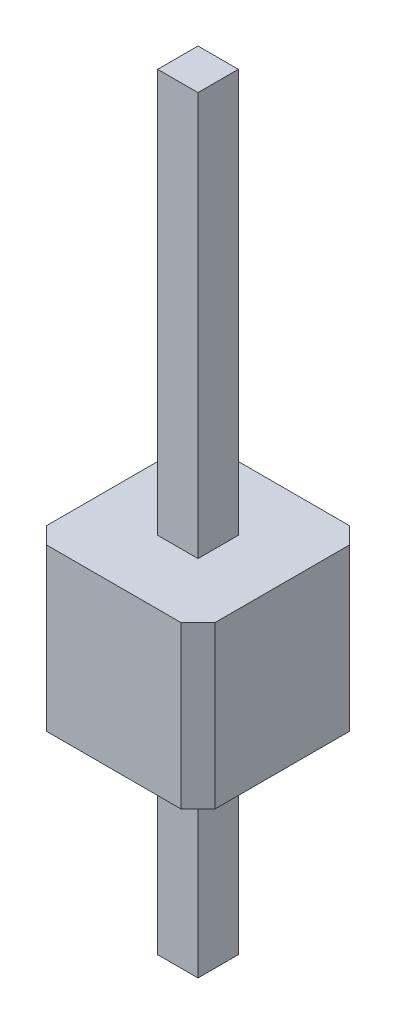
ISO-10303-21;
HEADER;
FILE_DESCRIPTION(('STEP AP214'),'2;1');
FILE_NAME('part.step','',(''),(''),'','','');
FILE_SCHEMA(('AUTOMOTIVE_DESIGN { 1 0 10303 214 1 1 1 1 }'));
ENDSEC;
DATA;
#1=APPLICATION_CONTEXT('core data for automotive mechanical design processes');
#2=APPLICATION_PROTOCOL_DEFINITION('international standard','automotive_design',2000,#1);
#3=PRODUCT_CONTEXT('',#1,'mechanical');
#4=PRODUCT('Part','Part','',(#3));
#5=PRODUCT_RELATED_PRODUCT_CATEGORY('part','',(#4));
#6=PRODUCT_DEFINITION_FORMATION('','',#4);
#7=PRODUCT_DEFINITION_CONTEXT('part definition',#1,'design');
#8=PRODUCT_DEFINITION('design','',#6,#7);
#9=PRODUCT_DEFINITION_SHAPE('','',#8);
#10=(LENGTH_UNIT() NAMED_UNIT(*) SI_UNIT(.MILLI.,.METRE.));
#11=(NAMED_UNIT(*) PLANE_ANGLE_UNIT() SI_UNIT($,.RADIAN.));
#12=(NAMED_UNIT(*) SI_UNIT($,.STERADIAN.) SOLID_ANGLE_UNIT());
#13=UNCERTAINTY_MEASURE_WITH_UNIT(LENGTH_MEASURE(1.E-05),#10,'distance_accuracy_value','');
#14=(GEOMETRIC_REPRESENTATION_CONTEXT(3) GLOBAL_UNCERTAINTY_ASSIGNED_CONTEXT((#13)) GLOBAL_UNIT_ASSIGNED_CONTEXT((#10,
#11,#12)) REPRESENTATION_CONTEXT('',''));
#15=CARTESIAN_POINT('',(0.,0.,0.));
#16=DIRECTION('',(0.,0.,1.));
#17=DIRECTION('',(1.,0.,0.));
#18=AXIS2_PLACEMENT_3D('',#15,#16,#17);
#19=CARTESIAN_POINT('',(0.,2.4,0.));
#20=DIRECTION('',(0.,-1.,0.));
#21=DIRECTION('',(0.,0.,-1.));
#22=AXIS2_PLACEMENT_3D('',#19,#20,#21);
#23=PLANE('',#22);
#24=DIRECTION('',(-0.707106781186547,0.,-0.707106781186548));
#25=VECTOR('',#24,1.);
#26=CARTESIAN_POINT('',(1.,2.4,-1.25));
#27=LINE('',#26,#25);
#28=CARTESIAN_POINT('',(1.25,2.4,-0.999999999999999));
#29=VERTEX_POINT('',#28);
#30=CARTESIAN_POINT('',(1.,2.4,-1.25));
#31=VERTEX_POINT('',#30);
#32=EDGE_CURVE('E207',#29,#31,#27,.T.);
#33=ORIENTED_EDGE('',*,*,#32,.T.);
#34=DIRECTION('',(-1.,0.,0.));
#35=VECTOR('',#34,1.);
#36=CARTESIAN_POINT('',(-1.,2.4,-1.25));
#37=LINE('',#36,#35);
#38=CARTESIAN_POINT('',(-1.,2.4,-1.25));
#39=VERTEX_POINT('',#38);
#40=EDGE_CURVE('E210',#31,#39,#37,.T.);
#41=ORIENTED_EDGE('',*,*,#40,.T.);
#42=DIRECTION('',(-0.707106781186548,0.,0.707106781186548));
#43=VECTOR('',#42,1.);
#44=CARTESIAN_POINT('',(-1.,2.4,-1.25));
#45=LINE('',#44,#43);
#46=CARTESIAN_POINT('',(-1.25,2.4,-0.999999999999999));
#47=VERTEX_POINT('',#46);
#48=EDGE_CURVE('E213',#39,#47,#45,.T.);
#49=ORIENTED_EDGE('',*,*,#48,.T.);
#50=DIRECTION('',(0.,0.,1.));
#51=VECTOR('',#50,1.);
#52=CARTESIAN_POINT('',(-1.25,2.4,-0.999999999999999));
#53=LINE('',#52,#51);
#54=CARTESIAN_POINT('',(-1.25,2.4,1.));
#55=VERTEX_POINT('',#54);
#56=EDGE_CURVE('E215',#47,#55,#53,.T.);
#57=ORIENTED_EDGE('',*,*,#56,.T.);
#58=DIRECTION('',(0.707106781186548,0.,0.707106781186548));
#59=VECTOR('',#58,1.);
#60=CARTESIAN_POINT('',(-1.25,2.4,1.));
#61=LINE('',#60,#59);
#62=CARTESIAN_POINT('',(-1.,2.4,1.25));
#63=VERTEX_POINT('',#62);
#64=EDGE_CURVE('E217',#55,#63,#61,.T.);
#65=ORIENTED_EDGE('',*,*,#64,.T.);
#66=DIRECTION('',(1.,0.,0.));
#67=VECTOR('',#66,1.);
#68=CARTESIAN_POINT('',(-1.,2.4,1.25));
#69=LINE('',#68,#67);
#70=CARTESIAN_POINT('',(1.,2.4,1.25));
#71=VERTEX_POINT('',#70);
#72=EDGE_CURVE('E219',#63,#71,#69,.T.);
#73=ORIENTED_EDGE('',*,*,#72,.T.);
#74=DIRECTION('',(0.707106781186548,0.,-0.707106781186547));
#75=VECTOR('',#74,1.);
#76=CARTESIAN_POINT('',(1.25,2.4,1.));
#77=LINE('',#76,#75);
#78=CARTESIAN_POINT('',(1.25,2.4,1.));
#79=VERTEX_POINT('',#78);
#80=EDGE_CURVE('E221',#71,#79,#77,.T.);
#81=ORIENTED_EDGE('',*,*,#80,.T.);
#82=DIRECTION('',(0.,0.,-1.));
#83=VECTOR('',#82,1.);
#84=CARTESIAN_POINT('',(1.25,2.4,-0.999999999999999));
#85=LINE('',#84,#83);
#86=EDGE_CURVE('E223',#79,#29,#85,.T.);
#87=ORIENTED_EDGE('',*,*,#86,.T.);
#88=EDGE_LOOP('',(#33,#41,#49,#57,#65,#73,#81,#87));
#89=FACE_BOUND('',#88,.T.);
#90=DIRECTION('',(0.,0.,-1.));
#91=VECTOR('',#90,1.);
#92=CARTESIAN_POINT('',(0.3,2.4,-0.3));
#93=LINE('',#92,#91);
#94=CARTESIAN_POINT('',(0.3,2.4,0.3));
#95=VERTEX_POINT('',#94);
#96=CARTESIAN_POINT('',(0.3,2.4,-0.3));
#97=VERTEX_POINT('',#96);
#98=EDGE_CURVE('E170',#95,#97,#93,.T.);
#99=ORIENTED_EDGE('',*,*,#98,.F.);
#100=DIRECTION('',(1.,0.,0.));
#101=VECTOR('',#100,1.);
#102=CARTESIAN_POINT('',(-0.3,2.4,0.3));
#103=LINE('',#102,#101);
#104=CARTESIAN_POINT('',(-0.3,2.4,0.3));
#105=VERTEX_POINT('',#104);
#106=EDGE_CURVE('E178',#105,#95,#103,.T.);
#107=ORIENTED_EDGE('',*,*,#106,.F.);
#108=DIRECTION('',(0.,0.,1.));
#109=VECTOR('',#108,1.);
#110=CARTESIAN_POINT('',(-0.3,2.4,-0.3));
#111=LINE('',#110,#109);
#112=CARTESIAN_POINT('',(-0.3,2.4,-0.3));
#113=VERTEX_POINT('',#112);
#114=EDGE_CURVE('E190',#113,#105,#111,.T.);
#115=ORIENTED_EDGE('',*,*,#114,.F.);
#116=DIRECTION('',(-1.,0.,0.));
#117=VECTOR('',#116,1.);
#118=CARTESIAN_POINT('',(-0.3,2.4,-0.3));
#119=LINE('',#118,#117);
#120=EDGE_CURVE('E187',#97,#113,#119,.T.);
#121=ORIENTED_EDGE('',*,*,#120,.F.);
#122=EDGE_LOOP('',(#99,#107,#115,#121));
#123=FACE_BOUND('',#122,.T.);
#124=ADVANCED_FACE('F33',(#89,#123),#23,.F.);
#125=CARTESIAN_POINT('',(1.,2.4,-1.25));
#126=DIRECTION('',(-0.707106781186548,0.,0.707106781186547));
#127=DIRECTION('',(0.707106781186547,0.,0.707106781186548));
#128=AXIS2_PLACEMENT_3D('',#125,#126,#127);
#129=PLANE('',#128);
#130=DIRECTION('',(-0.707106781186547,0.,-0.707106781186548));
#131=VECTOR('',#130,1.);
#132=CARTESIAN_POINT('',(1.,0.,-1.25));
#133=LINE('',#132,#131);
#134=CARTESIAN_POINT('',(1.25,0.,-0.999999999999999));
#135=VERTEX_POINT('',#134);
#136=CARTESIAN_POINT('',(1.,0.,-1.25));
#137=VERTEX_POINT('',#136);
#138=EDGE_CURVE('E206',#135,#137,#133,.T.);
#139=ORIENTED_EDGE('',*,*,#138,.T.);
#140=DIRECTION('',(0.,-1.,0.));
#141=VECTOR('',#140,1.);
#142=CARTESIAN_POINT('',(1.,2.4,-1.25));
#143=LINE('',#142,#141);
#144=EDGE_CURVE('E261',#31,#137,#143,.T.);
#145=ORIENTED_EDGE('',*,*,#144,.F.);
#146=ORIENTED_EDGE('',*,*,#32,.F.);
#147=DIRECTION('',(0.,-1.,0.));
#148=VECTOR('',#147,1.);
#149=CARTESIAN_POINT('',(1.25,2.4,-0.999999999999999));
#150=LINE('',#149,#148);
#151=EDGE_CURVE('E225',#29,#135,#150,.T.);
#152=ORIENTED_EDGE('',*,*,#151,.T.);
#153=EDGE_LOOP('',(#139,#145,#146,#152));
#154=FACE_BOUND('',#153,.T.);
#155=ADVANCED_FACE('F35',(#154),#129,.F.);
#156=CARTESIAN_POINT('',(-1.,2.4,-1.25));
#157=DIRECTION('',(0.,0.,1.));
#158=DIRECTION('',(1.,0.,0.));
#159=AXIS2_PLACEMENT_3D('',#156,#157,#158);
#160=PLANE('',#159);
#161=DIRECTION('',(-1.,0.,0.));
#162=VECTOR('',#161,1.);
#163=CARTESIAN_POINT('',(-1.,0.,-1.25));
#164=LINE('',#163,#162);
#165=CARTESIAN_POINT('',(-1.,0.,-1.25));
#166=VERTEX_POINT('',#165);
#167=EDGE_CURVE('E228',#137,#166,#164,.T.);
#168=ORIENTED_EDGE('',*,*,#167,.T.);
#169=DIRECTION('',(0.,-1.,0.));
#170=VECTOR('',#169,1.);
#171=CARTESIAN_POINT('',(-1.,2.4,-1.25));
#172=LINE('',#171,#170);
#173=EDGE_CURVE('E258',#39,#166,#172,.T.);
#174=ORIENTED_EDGE('',*,*,#173,.F.);
#175=ORIENTED_EDGE('',*,*,#40,.F.);
#176=ORIENTED_EDGE('',*,*,#144,.T.);
#177=EDGE_LOOP('',(#168,#174,#175,#176));
#178=FACE_BOUND('',#177,.T.);
#179=ADVANCED_FACE('F313',(#178),#160,.F.);
#180=CARTESIAN_POINT('',(-1.,2.4,-1.25));
#181=DIRECTION('',(0.707106781186548,0.,0.707106781186548));
#182=DIRECTION('',(0.707106781186548,0.,-0.707106781186548));
#183=AXIS2_PLACEMENT_3D('',#180,#181,#182);
#184=PLANE('',#183);
#185=DIRECTION('',(-0.707106781186548,0.,0.707106781186548));
#186=VECTOR('',#185,1.);
#187=CARTESIAN_POINT('',(-1.,0.,-1.25));
#188=LINE('',#187,#186);
#189=CARTESIAN_POINT('',(-1.25,0.,-0.999999999999999));
#190=VERTEX_POINT('',#189);
#191=EDGE_CURVE('E230',#166,#190,#188,.T.);
#192=ORIENTED_EDGE('',*,*,#191,.T.);
#193=DIRECTION('',(0.,-1.,0.));
#194=VECTOR('',#193,1.);
#195=CARTESIAN_POINT('',(-1.25,2.4,-0.999999999999999));
#196=LINE('',#195,#194);
#197=EDGE_CURVE('E255',#47,#190,#196,.T.);
#198=ORIENTED_EDGE('',*,*,#197,.F.);
#199=ORIENTED_EDGE('',*,*,#48,.F.);
#200=ORIENTED_EDGE('',*,*,#173,.T.);
#201=EDGE_LOOP('',(#192,#198,#199,#200));
#202=FACE_BOUND('',#201,.T.);
#203=ADVANCED_FACE('F309',(#202),#184,.F.);
#204=CARTESIAN_POINT('',(-1.25,2.4,-0.999999999999999));
#205=DIRECTION('',(1.,0.,0.));
#206=DIRECTION('',(0.,0.,-1.));
#207=AXIS2_PLACEMENT_3D('',#204,#205,#206);
#208=PLANE('',#207);
#209=DIRECTION('',(0.,0.,1.));
#210=VECTOR('',#209,1.);
#211=CARTESIAN_POINT('',(-1.25,0.,-0.999999999999999));
#212=LINE('',#211,#210);
#213=CARTESIAN_POINT('',(-1.25,0.,1.));
#214=VERTEX_POINT('',#213);
#215=EDGE_CURVE('E232',#190,#214,#212,.T.);
#216=ORIENTED_EDGE('',*,*,#215,.T.);
#217=DIRECTION('',(0.,-1.,0.));
#218=VECTOR('',#217,1.);
#219=CARTESIAN_POINT('',(-1.25,2.4,1.));
#220=LINE('',#219,#218);
#221=EDGE_CURVE('E252',#55,#214,#220,.T.);
#222=ORIENTED_EDGE('',*,*,#221,.F.);
#223=ORIENTED_EDGE('',*,*,#56,.F.);
#224=ORIENTED_EDGE('',*,*,#197,.T.);
#225=EDGE_LOOP('',(#216,#222,#223,#224));
#226=FACE_BOUND('',#225,.T.);
#227=ADVANCED_FACE('F306',(#226),#208,.F.);
#228=CARTESIAN_POINT('',(-1.25,2.4,1.));
#229=DIRECTION('',(0.707106781186548,0.,-0.707106781186548));
#230=DIRECTION('',(-0.707106781186548,0.,-0.707106781186548));
#231=AXIS2_PLACEMENT_3D('',#228,#229,#230);
#232=PLANE('',#231);
#233=DIRECTION('',(0.707106781186548,0.,0.707106781186548));
#234=VECTOR('',#233,1.);
#235=CARTESIAN_POINT('',(-1.25,0.,1.));
#236=LINE('',#235,#234);
#237=CARTESIAN_POINT('',(-1.,0.,1.25));
#238=VERTEX_POINT('',#237);
#239=EDGE_CURVE('E234',#214,#238,#236,.T.);
#240=ORIENTED_EDGE('',*,*,#239,.T.);
#241=DIRECTION('',(0.,-1.,0.));
#242=VECTOR('',#241,1.);
#243=CARTESIAN_POINT('',(-1.,2.4,1.25));
#244=LINE('',#243,#242);
#245=EDGE_CURVE('E249',#63,#238,#244,.T.);
#246=ORIENTED_EDGE('',*,*,#245,.F.);
#247=ORIENTED_EDGE('',*,*,#64,.F.);
#248=ORIENTED_EDGE('',*,*,#221,.T.);
#249=EDGE_LOOP('',(#240,#246,#247,#248));
#250=FACE_BOUND('',#249,.T.);
#251=ADVANCED_FACE('F302',(#250),#232,.F.);
#252=CARTESIAN_POINT('',(-1.,2.4,1.25));
#253=DIRECTION('',(0.,0.,-1.));
#254=DIRECTION('',(-1.,0.,0.));
#255=AXIS2_PLACEMENT_3D('',#252,#253,#254);
#256=PLANE('',#255);
#257=DIRECTION('',(1.,0.,0.));
#258=VECTOR('',#257,1.);
#259=CARTESIAN_POINT('',(-1.,0.,1.25));
#260=LINE('',#259,#258);
#261=CARTESIAN_POINT('',(1.,0.,1.25));
#262=VERTEX_POINT('',#261);
#263=EDGE_CURVE('E236',#238,#262,#260,.T.);
#264=ORIENTED_EDGE('',*,*,#263,.T.);
#265=DIRECTION('',(0.,-1.,0.));
#266=VECTOR('',#265,1.);
#267=CARTESIAN_POINT('',(1.,2.4,1.25));
#268=LINE('',#267,#266);
#269=EDGE_CURVE('E246',#71,#262,#268,.T.);
#270=ORIENTED_EDGE('',*,*,#269,.F.);
#271=ORIENTED_EDGE('',*,*,#72,.F.);
#272=ORIENTED_EDGE('',*,*,#245,.T.);
#273=EDGE_LOOP('',(#264,#270,#271,#272));
#274=FACE_BOUND('',#273,.T.);
#275=ADVANCED_FACE('F297',(#274),#256,.F.);
#276=CARTESIAN_POINT('',(1.25,2.4,1.));
#277=DIRECTION('',(-0.707106781186547,0.,-0.707106781186548));
#278=DIRECTION('',(-0.707106781186548,0.,0.707106781186547));
#279=AXIS2_PLACEMENT_3D('',#276,#277,#278);
#280=PLANE('',#279);
#281=DIRECTION('',(0.707106781186548,0.,-0.707106781186547));
#282=VECTOR('',#281,1.);
#283=CARTESIAN_POINT('',(1.25,0.,1.));
#284=LINE('',#283,#282);
#285=CARTESIAN_POINT('',(1.25,0.,1.));
#286=VERTEX_POINT('',#285);
#287=EDGE_CURVE('E238',#262,#286,#284,.T.);
#288=ORIENTED_EDGE('',*,*,#287,.T.);
#289=DIRECTION('',(0.,-1.,0.));
#290=VECTOR('',#289,1.);
#291=CARTESIAN_POINT('',(1.25,2.4,1.));
#292=LINE('',#291,#290);
#293=EDGE_CURVE('E243',#79,#286,#292,.T.);
#294=ORIENTED_EDGE('',*,*,#293,.F.);
#295=ORIENTED_EDGE('',*,*,#80,.F.);
#296=ORIENTED_EDGE('',*,*,#269,.T.);
#297=EDGE_LOOP('',(#288,#294,#295,#296));
#298=FACE_BOUND('',#297,.T.);
#299=ADVANCED_FACE('F291',(#298),#280,.F.);
#300=CARTESIAN_POINT('',(1.25,2.4,-0.999999999999999));
#301=DIRECTION('',(-1.,0.,0.));
#302=DIRECTION('',(0.,0.,1.));
#303=AXIS2_PLACEMENT_3D('',#300,#301,#302);
#304=PLANE('',#303);
#305=DIRECTION('',(0.,0.,-1.));
#306=VECTOR('',#305,1.);
#307=CARTESIAN_POINT('',(1.25,0.,-0.999999999999999));
#308=LINE('',#307,#306);
#309=EDGE_CURVE('E211',#286,#135,#308,.T.);
#310=ORIENTED_EDGE('',*,*,#309,.T.);
#311=ORIENTED_EDGE('',*,*,#151,.F.);
#312=ORIENTED_EDGE('',*,*,#86,.F.);
#313=ORIENTED_EDGE('',*,*,#293,.T.);
#314=EDGE_LOOP('',(#310,#311,#312,#313));
#315=FACE_BOUND('',#314,.T.);
#316=ADVANCED_FACE('F276',(#315),#304,.F.);
#317=CARTESIAN_POINT('',(0.,0.,0.));
#318=DIRECTION('',(0.,-1.,0.));
#319=DIRECTION('',(0.,0.,-1.));
#320=AXIS2_PLACEMENT_3D('',#317,#318,#319);
#321=PLANE('',#320);
#322=DIRECTION('',(0.,0.,1.));
#323=VECTOR('',#322,1.);
#324=CARTESIAN_POINT('',(0.3,0.,0.));
#325=LINE('',#324,#323);
#326=CARTESIAN_POINT('',(0.3,0.,-0.3));
#327=VERTEX_POINT('',#326);
#328=CARTESIAN_POINT('',(0.3,0.,0.3));
#329=VERTEX_POINT('',#328);
#330=EDGE_CURVE('E11',#327,#329,#325,.T.);
#331=ORIENTED_EDGE('',*,*,#330,.F.);
#332=DIRECTION('',(1.,0.,0.));
#333=VECTOR('',#332,1.);
#334=CARTESIAN_POINT('',(0.,0.,-0.3));
#335=LINE('',#334,#333);
#336=CARTESIAN_POINT('',(-0.3,0.,-0.3));
#337=VERTEX_POINT('',#336);
#338=EDGE_CURVE('E41',#337,#327,#335,.T.);
#339=ORIENTED_EDGE('',*,*,#338,.F.);
#340=DIRECTION('',(0.,0.,-1.));
#341=VECTOR('',#340,1.);
#342=CARTESIAN_POINT('',(-0.3,0.,0.));
#343=LINE('',#342,#341);
#344=CARTESIAN_POINT('',(-0.3,0.,0.3));
#345=VERTEX_POINT('',#344);
#346=EDGE_CURVE('E266',#345,#337,#343,.T.);
#347=ORIENTED_EDGE('',*,*,#346,.F.);
#348=DIRECTION('',(-1.,0.,0.));
#349=VECTOR('',#348,1.);
#350=CARTESIAN_POINT('',(0.,0.,0.3));
#351=LINE('',#350,#349);
#352=EDGE_CURVE('E264',#329,#345,#351,.T.);
#353=ORIENTED_EDGE('',*,*,#352,.F.);
#354=EDGE_LOOP('',(#331,#339,#347,#353));
#355=FACE_BOUND('',#354,.T.);
#356=ORIENTED_EDGE('',*,*,#138,.F.);
#357=ORIENTED_EDGE('',*,*,#309,.F.);
#358=ORIENTED_EDGE('',*,*,#287,.F.);
#359=ORIENTED_EDGE('',*,*,#263,.F.);
#360=ORIENTED_EDGE('',*,*,#239,.F.);
#361=ORIENTED_EDGE('',*,*,#215,.F.);
#362=ORIENTED_EDGE('',*,*,#191,.F.);
#363=ORIENTED_EDGE('',*,*,#167,.F.);
#364=EDGE_LOOP('',(#356,#357,#358,#359,#360,#361,#362,#363));
#365=FACE_BOUND('',#364,.T.);
#366=ADVANCED_FACE('F272',(#355,#365),#321,.T.);
#367=CARTESIAN_POINT('',(0.3,8.4,-0.3));
#368=DIRECTION('',(-1.,0.,0.));
#369=DIRECTION('',(0.,0.,1.));
#370=AXIS2_PLACEMENT_3D('',#367,#368,#369);
#371=PLANE('',#370);
#372=ORIENTED_EDGE('',*,*,#98,.T.);
#373=DIRECTION('',(0.,-1.,0.));
#374=VECTOR('',#373,1.);
#375=CARTESIAN_POINT('',(0.3,8.4,-0.3));
#376=LINE('',#375,#374);
#377=CARTESIAN_POINT('',(0.3,8.4,-0.3));
#378=VERTEX_POINT('',#377);
#379=EDGE_CURVE('E203',#378,#97,#376,.T.);
#380=ORIENTED_EDGE('',*,*,#379,.F.);
#381=DIRECTION('',(0.,0.,-1.));
#382=VECTOR('',#381,1.);
#383=CARTESIAN_POINT('',(0.3,8.4,-0.3));
#384=LINE('',#383,#382);
#385=CARTESIAN_POINT('',(0.3,8.4,0.3));
#386=VERTEX_POINT('',#385);
#387=EDGE_CURVE('E174',#386,#378,#384,.T.);
#388=ORIENTED_EDGE('',*,*,#387,.F.);
#389=DIRECTION('',(0.,-1.,0.));
#390=VECTOR('',#389,1.);
#391=CARTESIAN_POINT('',(0.3,8.4,0.3));
#392=LINE('',#391,#390);
#393=EDGE_CURVE('E184',#386,#95,#392,.T.);
#394=ORIENTED_EDGE('',*,*,#393,.T.);
#395=EDGE_LOOP('',(#372,#380,#388,#394));
#396=FACE_BOUND('',#395,.T.);
#397=ADVANCED_FACE('F275',(#396),#371,.F.);
#398=CARTESIAN_POINT('',(-0.3,8.4,-0.3));
#399=DIRECTION('',(0.,0.,1.));
#400=DIRECTION('',(1.,0.,0.));
#401=AXIS2_PLACEMENT_3D('',#398,#399,#400);
#402=PLANE('',#401);
#403=ORIENTED_EDGE('',*,*,#120,.T.);
#404=DIRECTION('',(0.,-1.,0.));
#405=VECTOR('',#404,1.);
#406=CARTESIAN_POINT('',(-0.3,8.4,-0.3));
#407=LINE('',#406,#405);
#408=CARTESIAN_POINT('',(-0.3,8.4,-0.3));
#409=VERTEX_POINT('',#408);
#410=EDGE_CURVE('E200',#409,#113,#407,.T.);
#411=ORIENTED_EDGE('',*,*,#410,.F.);
#412=DIRECTION('',(-1.,0.,0.));
#413=VECTOR('',#412,1.);
#414=CARTESIAN_POINT('',(-0.3,8.4,-0.3));
#415=LINE('',#414,#413);
#416=EDGE_CURVE('E177',#378,#409,#415,.T.);
#417=ORIENTED_EDGE('',*,*,#416,.F.);
#418=ORIENTED_EDGE('',*,*,#379,.T.);
#419=EDGE_LOOP('',(#403,#411,#417,#418));
#420=FACE_BOUND('',#419,.T.);
#421=ADVANCED_FACE('F333',(#420),#402,.F.);
#422=CARTESIAN_POINT('',(-0.3,8.4,-0.3));
#423=DIRECTION('',(1.,0.,0.));
#424=DIRECTION('',(0.,0.,-1.));
#425=AXIS2_PLACEMENT_3D('',#422,#423,#424);
#426=PLANE('',#425);
#427=ORIENTED_EDGE('',*,*,#114,.T.);
#428=DIRECTION('',(0.,-1.,0.));
#429=VECTOR('',#428,1.);
#430=CARTESIAN_POINT('',(-0.3,8.4,0.3));
#431=LINE('',#430,#429);
#432=CARTESIAN_POINT('',(-0.3,8.4,0.3));
#433=VERTEX_POINT('',#432);
#434=EDGE_CURVE('E197',#433,#105,#431,.T.);
#435=ORIENTED_EDGE('',*,*,#434,.F.);
#436=DIRECTION('',(0.,0.,1.));
#437=VECTOR('',#436,1.);
#438=CARTESIAN_POINT('',(-0.3,8.4,-0.3));
#439=LINE('',#438,#437);
#440=EDGE_CURVE('E180',#409,#433,#439,.T.);
#441=ORIENTED_EDGE('',*,*,#440,.F.);
#442=ORIENTED_EDGE('',*,*,#410,.T.);
#443=EDGE_LOOP('',(#427,#435,#441,#442));
#444=FACE_BOUND('',#443,.T.);
#445=ADVANCED_FACE('F331',(#444),#426,.F.);
#446=CARTESIAN_POINT('',(-0.3,8.4,0.3));
#447=DIRECTION('',(0.,0.,-1.));
#448=DIRECTION('',(-1.,0.,0.));
#449=AXIS2_PLACEMENT_3D('',#446,#447,#448);
#450=PLANE('',#449);
#451=ORIENTED_EDGE('',*,*,#106,.T.);
#452=ORIENTED_EDGE('',*,*,#393,.F.);
#453=DIRECTION('',(1.,0.,0.));
#454=VECTOR('',#453,1.);
#455=CARTESIAN_POINT('',(-0.3,8.4,0.3));
#456=LINE('',#455,#454);
#457=EDGE_CURVE('E182',#433,#386,#456,.T.);
#458=ORIENTED_EDGE('',*,*,#457,.F.);
#459=ORIENTED_EDGE('',*,*,#434,.T.);
#460=EDGE_LOOP('',(#451,#452,#458,#459));
#461=FACE_BOUND('',#460,.T.);
#462=ADVANCED_FACE('F322',(#461),#450,.F.);
#463=CARTESIAN_POINT('',(0.,8.4,0.));
#464=DIRECTION('',(0.,1.,0.));
#465=DIRECTION('',(0.,0.,1.));
#466=AXIS2_PLACEMENT_3D('',#463,#464,#465);
#467=PLANE('',#466);
#468=ORIENTED_EDGE('',*,*,#387,.T.);
#469=ORIENTED_EDGE('',*,*,#416,.T.);
#470=ORIENTED_EDGE('',*,*,#440,.T.);
#471=ORIENTED_EDGE('',*,*,#457,.T.);
#472=EDGE_LOOP('',(#468,#469,#470,#471));
#473=FACE_BOUND('',#472,.T.);
#474=ADVANCED_FACE('F327',(#473),#467,.T.);
#475=CARTESIAN_POINT('',(0.3,2.,0.3));
#476=DIRECTION('',(1.,0.,0.));
#477=DIRECTION('',(0.,0.,-1.));
#478=AXIS2_PLACEMENT_3D('',#475,#476,#477);
#479=PLANE('',#478);
#480=DIRECTION('',(0.,-1.,0.));
#481=VECTOR('',#480,1.);
#482=CARTESIAN_POINT('',(0.3,2.,-0.3));
#483=LINE('',#482,#481);
#484=CARTESIAN_POINT('',(0.3,-3.,-0.3));
#485=VERTEX_POINT('',#484);
#486=EDGE_CURVE('E168',#327,#485,#483,.T.);
#487=ORIENTED_EDGE('',*,*,#486,.F.);
#488=ORIENTED_EDGE('',*,*,#330,.T.);
#489=DIRECTION('',(0.,-1.,0.));
#490=VECTOR('',#489,1.);
#491=CARTESIAN_POINT('',(0.3,2.,0.3));
#492=LINE('',#491,#490);
#493=CARTESIAN_POINT('',(0.3,-3.,0.3));
#494=VERTEX_POINT('',#493);
#495=EDGE_CURVE('E141',#329,#494,#492,.T.);
#496=ORIENTED_EDGE('',*,*,#495,.T.);
#497=DIRECTION('',(0.,0.,1.));
#498=VECTOR('',#497,1.);
#499=CARTESIAN_POINT('',(0.3,-3.,0.3));
#500=LINE('',#499,#498);
#501=EDGE_CURVE('E146',#485,#494,#500,.T.);
#502=ORIENTED_EDGE('',*,*,#501,.F.);
#503=EDGE_LOOP('',(#487,#488,#496,#502));
#504=FACE_BOUND('',#503,.T.);
#505=ADVANCED_FACE('F144',(#504),#479,.T.);
#506=CARTESIAN_POINT('',(-0.3,2.,-0.3));
#507=DIRECTION('',(0.,0.,-1.));
#508=DIRECTION('',(-1.,0.,0.));
#509=AXIS2_PLACEMENT_3D('',#506,#507,#508);
#510=PLANE('',#509);
#511=DIRECTION('',(0.,-1.,0.));
#512=VECTOR('',#511,1.);
#513=CARTESIAN_POINT('',(-0.3,2.,-0.3));
#514=LINE('',#513,#512);
#515=CARTESIAN_POINT('',(-0.3,-3.,-0.3));
#516=VERTEX_POINT('',#515);
#517=EDGE_CURVE('E171',#337,#516,#514,.T.);
#518=ORIENTED_EDGE('',*,*,#517,.F.);
#519=ORIENTED_EDGE('',*,*,#338,.T.);
#520=ORIENTED_EDGE('',*,*,#486,.T.);
#521=DIRECTION('',(1.,0.,0.));
#522=VECTOR('',#521,1.);
#523=CARTESIAN_POINT('',(-0.3,-3.,-0.3));
#524=LINE('',#523,#522);
#525=EDGE_CURVE('E150',#516,#485,#524,.T.);
#526=ORIENTED_EDGE('',*,*,#525,.F.);
#527=EDGE_LOOP('',(#518,#519,#520,#526));
#528=FACE_BOUND('',#527,.T.);
#529=ADVANCED_FACE('F269',(#528),#510,.T.);
#530=CARTESIAN_POINT('',(-0.3,2.,0.3));
#531=DIRECTION('',(-1.,0.,0.));
#532=DIRECTION('',(0.,0.,1.));
#533=AXIS2_PLACEMENT_3D('',#530,#531,#532);
#534=PLANE('',#533);
#535=DIRECTION('',(0.,-1.,0.));
#536=VECTOR('',#535,1.);
#537=CARTESIAN_POINT('',(-0.3,2.,0.3));
#538=LINE('',#537,#536);
#539=CARTESIAN_POINT('',(-0.3,-3.,0.3));
#540=VERTEX_POINT('',#539);
#541=EDGE_CURVE('E149',#345,#540,#538,.T.);
#542=ORIENTED_EDGE('',*,*,#541,.F.);
#543=ORIENTED_EDGE('',*,*,#346,.T.);
#544=ORIENTED_EDGE('',*,*,#517,.T.);
#545=DIRECTION('',(0.,0.,-1.));
#546=VECTOR('',#545,1.);
#547=CARTESIAN_POINT('',(-0.3,-3.,0.3));
#548=LINE('',#547,#546);
#549=EDGE_CURVE('E159',#540,#516,#548,.T.);
#550=ORIENTED_EDGE('',*,*,#549,.F.);
#551=EDGE_LOOP('',(#542,#543,#544,#550));
#552=FACE_BOUND('',#551,.T.);
#553=ADVANCED_FACE('F271',(#552),#534,.T.);
#554=CARTESIAN_POINT('',(-0.3,2.,0.3));
#555=DIRECTION('',(0.,0.,1.));
#556=DIRECTION('',(1.,0.,0.));
#557=AXIS2_PLACEMENT_3D('',#554,#555,#556);
#558=PLANE('',#557);
#559=ORIENTED_EDGE('',*,*,#495,.F.);
#560=ORIENTED_EDGE('',*,*,#352,.T.);
#561=ORIENTED_EDGE('',*,*,#541,.T.);
#562=DIRECTION('',(-1.,0.,0.));
#563=VECTOR('',#562,1.);
#564=CARTESIAN_POINT('',(-0.3,-3.,0.3));
#565=LINE('',#564,#563);
#566=EDGE_CURVE('E153',#494,#540,#565,.T.);
#567=ORIENTED_EDGE('',*,*,#566,.F.);
#568=EDGE_LOOP('',(#559,#560,#561,#567));
#569=FACE_BOUND('',#568,.T.);
#570=ADVANCED_FACE('F154',(#569),#558,.T.);
#571=CARTESIAN_POINT('',(0.,-3.,0.));
#572=DIRECTION('',(0.,-1.,0.));
#573=DIRECTION('',(0.,0.,-1.));
#574=AXIS2_PLACEMENT_3D('',#571,#572,#573);
#575=PLANE('',#574);
#576=ORIENTED_EDGE('',*,*,#501,.T.);
#577=ORIENTED_EDGE('',*,*,#566,.T.);
#578=ORIENTED_EDGE('',*,*,#549,.T.);
#579=ORIENTED_EDGE('',*,*,#525,.T.);
#580=EDGE_LOOP('',(#576,#577,#578,#579));
#581=FACE_BOUND('',#580,.T.);
#582=ADVANCED_FACE('F162',(#581),#575,.T.);
#583=CLOSED_SHELL('',(#124,#155,#179,#203,#227,#251,#275,#299,#316,#366,#397,#421,#445,#462,
#474,#505,#529,#553,#570,#582));
#584=MANIFOLD_SOLID_BREP('B2',#583);
#585=ADVANCED_BREP_SHAPE_REPRESENTATION('',(#18,#584),#14);
#586=SHAPE_DEFINITION_REPRESENTATION(#9,#585);
ENDSEC;
END-ISO-10303-21;
